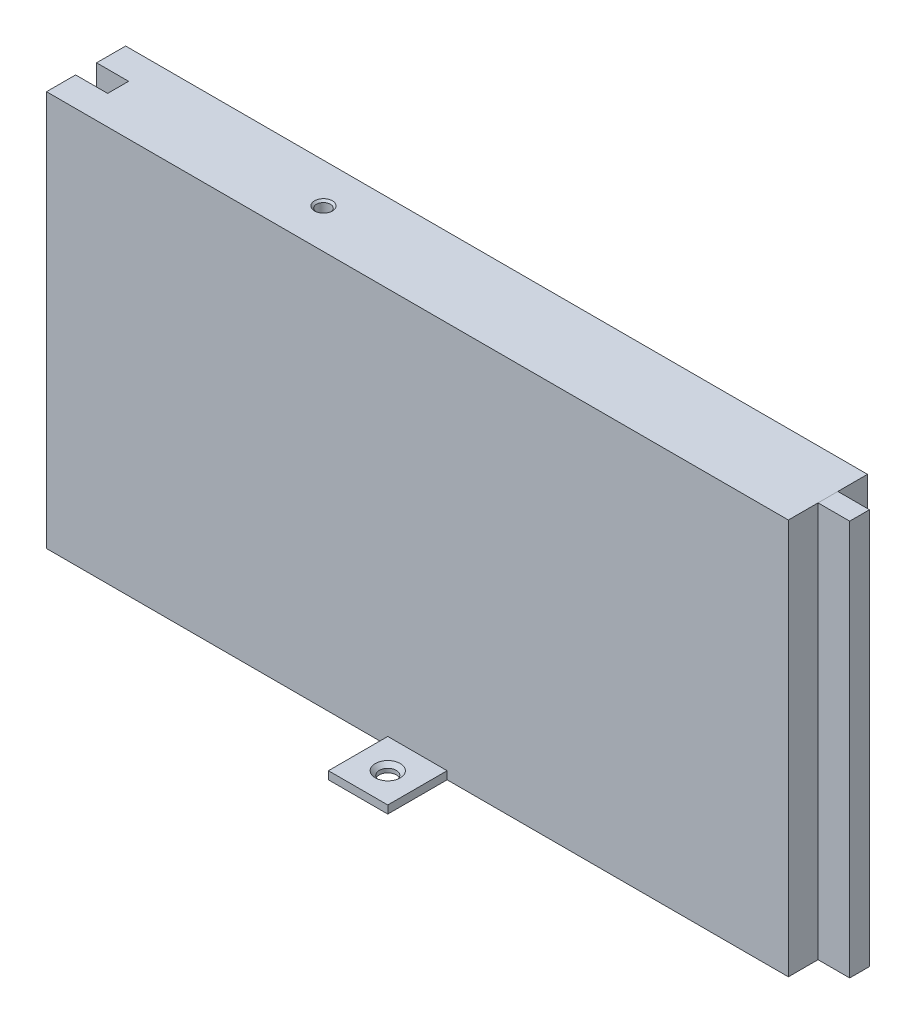
ISO-10303-21;
HEADER;
FILE_DESCRIPTION(('STEP AP214'),'2;1');
FILE_NAME('part.step','',(''),(''),'','','');
FILE_SCHEMA(('AUTOMOTIVE_DESIGN { 1 0 10303 214 1 1 1 1 }'));
ENDSEC;
DATA;
#1=APPLICATION_CONTEXT('core data for automotive mechanical design processes');
#2=APPLICATION_PROTOCOL_DEFINITION('international standard','automotive_design',2000,#1);
#3=PRODUCT_CONTEXT('',#1,'mechanical');
#4=PRODUCT('Part','Part','',(#3));
#5=PRODUCT_RELATED_PRODUCT_CATEGORY('part','',(#4));
#6=PRODUCT_DEFINITION_FORMATION('','',#4);
#7=PRODUCT_DEFINITION_CONTEXT('part definition',#1,'design');
#8=PRODUCT_DEFINITION('design','',#6,#7);
#9=PRODUCT_DEFINITION_SHAPE('','',#8);
#10=(LENGTH_UNIT() NAMED_UNIT(*) SI_UNIT(.MILLI.,.METRE.));
#11=(NAMED_UNIT(*) PLANE_ANGLE_UNIT() SI_UNIT($,.RADIAN.));
#12=(NAMED_UNIT(*) SI_UNIT($,.STERADIAN.) SOLID_ANGLE_UNIT());
#13=UNCERTAINTY_MEASURE_WITH_UNIT(LENGTH_MEASURE(1.E-05),#10,'distance_accuracy_value','');
#14=(GEOMETRIC_REPRESENTATION_CONTEXT(3) GLOBAL_UNCERTAINTY_ASSIGNED_CONTEXT((#13)) GLOBAL_UNIT_ASSIGNED_CONTEXT((#10,
#11,#12)) REPRESENTATION_CONTEXT('',''));
#15=CARTESIAN_POINT('',(0.,0.,0.));
#16=DIRECTION('',(0.,0.,1.));
#17=DIRECTION('',(1.,0.,0.));
#18=AXIS2_PLACEMENT_3D('',#15,#16,#17);
#19=CARTESIAN_POINT('',(187.5,0.,-7.5));
#20=DIRECTION('',(-1.,0.,0.));
#21=DIRECTION('',(0.,0.,1.));
#22=AXIS2_PLACEMENT_3D('',#19,#20,#21);
#23=PLANE('',#22);
#24=DIRECTION('',(0.,0.,1.));
#25=VECTOR('',#24,1.);
#26=CARTESIAN_POINT('',(187.5,100.,-7.5));
#27=LINE('',#26,#25);
#28=CARTESIAN_POINT('',(187.5,100.,-12.5));
#29=VERTEX_POINT('',#28);
#30=CARTESIAN_POINT('',(187.5,100.,-7.5));
#31=VERTEX_POINT('',#30);
#32=EDGE_CURVE('E120',#29,#31,#27,.T.);
#33=ORIENTED_EDGE('',*,*,#32,.F.);
#34=DIRECTION('',(0.,1.,0.));
#35=VECTOR('',#34,1.);
#36=CARTESIAN_POINT('',(187.5,0.,-12.5));
#37=LINE('',#36,#35);
#38=CARTESIAN_POINT('',(187.5,0.,-12.5));
#39=VERTEX_POINT('',#38);
#40=EDGE_CURVE('E12',#39,#29,#37,.T.);
#41=ORIENTED_EDGE('',*,*,#40,.F.);
#42=DIRECTION('',(0.,0.,1.));
#43=VECTOR('',#42,1.);
#44=CARTESIAN_POINT('',(187.5,0.,-7.5));
#45=LINE('',#44,#43);
#46=CARTESIAN_POINT('',(187.5,0.,-7.5));
#47=VERTEX_POINT('',#46);
#48=EDGE_CURVE('E114',#39,#47,#45,.T.);
#49=ORIENTED_EDGE('',*,*,#48,.T.);
#50=DIRECTION('',(0.,1.,0.));
#51=VECTOR('',#50,1.);
#52=CARTESIAN_POINT('',(187.5,0.,-7.5));
#53=LINE('',#52,#51);
#54=EDGE_CURVE('E59',#47,#31,#53,.T.);
#55=ORIENTED_EDGE('',*,*,#54,.T.);
#56=EDGE_LOOP('',(#33,#41,#49,#55));
#57=FACE_BOUND('',#56,.T.);
#58=ADVANCED_FACE('F56',(#57),#23,.T.);
#59=CARTESIAN_POINT('',(187.5,0.,-12.5));
#60=DIRECTION('',(0.,0.,-1.));
#61=DIRECTION('',(-1.,0.,0.));
#62=AXIS2_PLACEMENT_3D('',#59,#60,#61);
#63=PLANE('',#62);
#64=DIRECTION('',(-1.,0.,0.));
#65=VECTOR('',#64,1.);
#66=CARTESIAN_POINT('',(187.5,100.,-12.5));
#67=LINE('',#66,#65);
#68=CARTESIAN_POINT('',(195.5,100.,-12.5));
#69=VERTEX_POINT('',#68);
#70=EDGE_CURVE('E116',#69,#29,#67,.T.);
#71=ORIENTED_EDGE('',*,*,#70,.F.);
#72=DIRECTION('',(0.,1.,0.));
#73=VECTOR('',#72,1.);
#74=CARTESIAN_POINT('',(195.5,0.,-12.5));
#75=LINE('',#74,#73);
#76=CARTESIAN_POINT('',(195.5,0.,-12.5));
#77=VERTEX_POINT('',#76);
#78=EDGE_CURVE('E65',#77,#69,#75,.T.);
#79=ORIENTED_EDGE('',*,*,#78,.F.);
#80=DIRECTION('',(-1.,0.,0.));
#81=VECTOR('',#80,1.);
#82=CARTESIAN_POINT('',(187.5,0.,-12.5));
#83=LINE('',#82,#81);
#84=EDGE_CURVE('E111',#77,#39,#83,.T.);
#85=ORIENTED_EDGE('',*,*,#84,.T.);
#86=ORIENTED_EDGE('',*,*,#40,.T.);
#87=EDGE_LOOP('',(#71,#79,#85,#86));
#88=FACE_BOUND('',#87,.T.);
#89=ADVANCED_FACE('F130',(#88),#63,.T.);
#90=CARTESIAN_POINT('',(195.5,0.,-12.5));
#91=DIRECTION('',(1.,0.,0.));
#92=DIRECTION('',(0.,0.,-1.));
#93=AXIS2_PLACEMENT_3D('',#90,#91,#92);
#94=PLANE('',#93);
#95=DIRECTION('',(0.,0.,-1.));
#96=VECTOR('',#95,1.);
#97=CARTESIAN_POINT('',(195.5,100.,-12.5));
#98=LINE('',#97,#96);
#99=CARTESIAN_POINT('',(195.5,100.,-7.5));
#100=VERTEX_POINT('',#99);
#101=EDGE_CURVE('E106',#100,#69,#98,.T.);
#102=ORIENTED_EDGE('',*,*,#101,.F.);
#103=DIRECTION('',(0.,1.,0.));
#104=VECTOR('',#103,1.);
#105=CARTESIAN_POINT('',(195.5,0.,-7.5));
#106=LINE('',#105,#104);
#107=CARTESIAN_POINT('',(195.5,0.,-7.5));
#108=VERTEX_POINT('',#107);
#109=EDGE_CURVE('E101',#108,#100,#106,.T.);
#110=ORIENTED_EDGE('',*,*,#109,.F.);
#111=DIRECTION('',(0.,0.,-1.));
#112=VECTOR('',#111,1.);
#113=CARTESIAN_POINT('',(195.5,0.,-12.5));
#114=LINE('',#113,#112);
#115=EDGE_CURVE('E104',#108,#77,#114,.T.);
#116=ORIENTED_EDGE('',*,*,#115,.T.);
#117=ORIENTED_EDGE('',*,*,#78,.T.);
#118=EDGE_LOOP('',(#102,#110,#116,#117));
#119=FACE_BOUND('',#118,.T.);
#120=ADVANCED_FACE('F103',(#119),#94,.T.);
#121=CARTESIAN_POINT('',(195.5,0.,-7.5));
#122=DIRECTION('',(0.,0.,1.));
#123=DIRECTION('',(1.,0.,0.));
#124=AXIS2_PLACEMENT_3D('',#121,#122,#123);
#125=PLANE('',#124);
#126=DIRECTION('',(1.,0.,0.));
#127=VECTOR('',#126,1.);
#128=CARTESIAN_POINT('',(195.5,100.,-7.5));
#129=LINE('',#128,#127);
#130=EDGE_CURVE('E123',#31,#100,#129,.T.);
#131=ORIENTED_EDGE('',*,*,#130,.F.);
#132=ORIENTED_EDGE('',*,*,#54,.F.);
#133=DIRECTION('',(1.,0.,0.));
#134=VECTOR('',#133,1.);
#135=CARTESIAN_POINT('',(195.5,0.,-7.5));
#136=LINE('',#135,#134);
#137=EDGE_CURVE('E110',#47,#108,#136,.T.);
#138=ORIENTED_EDGE('',*,*,#137,.T.);
#139=ORIENTED_EDGE('',*,*,#109,.T.);
#140=EDGE_LOOP('',(#131,#132,#138,#139));
#141=FACE_BOUND('',#140,.T.);
#142=ADVANCED_FACE('F113',(#141),#125,.T.);
#143=CARTESIAN_POINT('',(0.,0.,0.));
#144=DIRECTION('',(0.,-1.,0.));
#145=DIRECTION('',(0.,0.,-1.));
#146=AXIS2_PLACEMENT_3D('',#143,#144,#145);
#147=PLANE('',#146);
#148=ORIENTED_EDGE('',*,*,#48,.F.);
#149=ORIENTED_EDGE('',*,*,#84,.F.);
#150=ORIENTED_EDGE('',*,*,#115,.F.);
#151=ORIENTED_EDGE('',*,*,#137,.F.);
#152=EDGE_LOOP('',(#148,#149,#150,#151));
#153=FACE_BOUND('',#152,.T.);
#154=ADVANCED_FACE('F109',(#153),#147,.T.);
#155=CARTESIAN_POINT('',(0.,100.,0.));
#156=DIRECTION('',(0.,-1.,0.));
#157=DIRECTION('',(0.,0.,-1.));
#158=AXIS2_PLACEMENT_3D('',#155,#156,#157);
#159=PLANE('',#158);
#160=ORIENTED_EDGE('',*,*,#32,.T.);
#161=ORIENTED_EDGE('',*,*,#130,.T.);
#162=ORIENTED_EDGE('',*,*,#101,.T.);
#163=ORIENTED_EDGE('',*,*,#70,.T.);
#164=EDGE_LOOP('',(#160,#161,#162,#163));
#165=FACE_BOUND('',#164,.T.);
#166=ADVANCED_FACE('F129',(#165),#159,.F.);
#167=CLOSED_SHELL('',(#58,#89,#120,#142,#154,#166));
#168=MANIFOLD_SOLID_BREP('B2',#167);
#169=CARTESIAN_POINT('',(187.5,100.,0.));
#170=DIRECTION('',(0.,0.,-1.));
#171=DIRECTION('',(-1.,0.,0.));
#172=AXIS2_PLACEMENT_3D('',#169,#170,#171);
#173=PLANE('',#172);
#174=DIRECTION('',(0.,-1.,0.));
#175=VECTOR('',#174,1.);
#176=CARTESIAN_POINT('',(86.25,2.,0.));
#177=LINE('',#176,#175);
#178=CARTESIAN_POINT('',(86.25,2.,0.));
#179=VERTEX_POINT('',#178);
#180=CARTESIAN_POINT('',(86.25,0.,0.));
#181=VERTEX_POINT('',#180);
#182=EDGE_CURVE('E196',#179,#181,#177,.T.);
#183=ORIENTED_EDGE('',*,*,#182,.F.);
#184=DIRECTION('',(-1.,0.,0.));
#185=VECTOR('',#184,1.);
#186=CARTESIAN_POINT('',(86.25,2.,0.));
#187=LINE('',#186,#185);
#188=CARTESIAN_POINT('',(101.25,2.,0.));
#189=VERTEX_POINT('',#188);
#190=EDGE_CURVE('E316',#189,#179,#187,.T.);
#191=ORIENTED_EDGE('',*,*,#190,.F.);
#192=DIRECTION('',(0.,1.,0.));
#193=VECTOR('',#192,1.);
#194=CARTESIAN_POINT('',(101.25,2.,0.));
#195=LINE('',#194,#193);
#196=CARTESIAN_POINT('',(101.25,0.,0.));
#197=VERTEX_POINT('',#196);
#198=EDGE_CURVE('E202',#197,#189,#195,.T.);
#199=ORIENTED_EDGE('',*,*,#198,.F.);
#200=DIRECTION('',(1.,0.,0.));
#201=VECTOR('',#200,1.);
#202=CARTESIAN_POINT('',(187.5,0.,0.));
#203=LINE('',#202,#201);
#204=CARTESIAN_POINT('',(187.5,0.,0.));
#205=VERTEX_POINT('',#204);
#206=EDGE_CURVE('E398',#197,#205,#203,.T.);
#207=ORIENTED_EDGE('',*,*,#206,.T.);
#208=DIRECTION('',(0.,-1.,0.));
#209=VECTOR('',#208,1.);
#210=CARTESIAN_POINT('',(187.5,100.,0.));
#211=LINE('',#210,#209);
#212=CARTESIAN_POINT('',(187.5,100.,0.));
#213=VERTEX_POINT('',#212);
#214=EDGE_CURVE('E449',#213,#205,#211,.T.);
#215=ORIENTED_EDGE('',*,*,#214,.F.);
#216=DIRECTION('',(1.,0.,0.));
#217=VECTOR('',#216,1.);
#218=CARTESIAN_POINT('',(187.5,100.,0.));
#219=LINE('',#218,#217);
#220=CARTESIAN_POINT('',(0.,100.,0.));
#221=VERTEX_POINT('',#220);
#222=EDGE_CURVE('E407',#221,#213,#219,.T.);
#223=ORIENTED_EDGE('',*,*,#222,.F.);
#224=DIRECTION('',(0.,-1.,0.));
#225=VECTOR('',#224,1.);
#226=CARTESIAN_POINT('',(0.,100.,0.));
#227=LINE('',#226,#225);
#228=CARTESIAN_POINT('',(0.,0.,0.));
#229=VERTEX_POINT('',#228);
#230=EDGE_CURVE('E423',#221,#229,#227,.T.);
#231=ORIENTED_EDGE('',*,*,#230,.T.);
#232=EDGE_CURVE('E424',#229,#181,#203,.T.);
#233=ORIENTED_EDGE('',*,*,#232,.T.);
#234=EDGE_LOOP('',(#183,#191,#199,#207,#215,#223,#231,#233));
#235=FACE_BOUND('',#234,.T.);
#236=ADVANCED_FACE('F179',(#235),#173,.F.);
#237=CARTESIAN_POINT('',(0.,100.,-20.));
#238=DIRECTION('',(0.,0.,1.));
#239=DIRECTION('',(1.,0.,0.));
#240=AXIS2_PLACEMENT_3D('',#237,#238,#239);
#241=PLANE('',#240);
#242=DIRECTION('',(0.,-1.,0.));
#243=VECTOR('',#242,1.);
#244=CARTESIAN_POINT('',(101.25,1.99999999999998,-20.));
#245=LINE('',#244,#243);
#246=CARTESIAN_POINT('',(101.25,1.99999999999998,-20.));
#247=VERTEX_POINT('',#246);
#248=CARTESIAN_POINT('',(101.25,0.,-20.));
#249=VERTEX_POINT('',#248);
#250=EDGE_CURVE('E320',#247,#249,#245,.T.);
#251=ORIENTED_EDGE('',*,*,#250,.F.);
#252=DIRECTION('',(1.,0.,0.));
#253=VECTOR('',#252,1.);
#254=CARTESIAN_POINT('',(101.25,1.99999999999998,-20.));
#255=LINE('',#254,#253);
#256=CARTESIAN_POINT('',(86.25,1.99999999999998,-20.));
#257=VERTEX_POINT('',#256);
#258=EDGE_CURVE('E336',#257,#247,#255,.T.);
#259=ORIENTED_EDGE('',*,*,#258,.F.);
#260=DIRECTION('',(0.,1.,0.));
#261=VECTOR('',#260,1.);
#262=CARTESIAN_POINT('',(86.25,1.99999999999998,-20.));
#263=LINE('',#262,#261);
#264=CARTESIAN_POINT('',(86.25,0.,-20.));
#265=VERTEX_POINT('',#264);
#266=EDGE_CURVE('E325',#265,#257,#263,.T.);
#267=ORIENTED_EDGE('',*,*,#266,.F.);
#268=DIRECTION('',(-1.,0.,0.));
#269=VECTOR('',#268,1.);
#270=CARTESIAN_POINT('',(0.,0.,-20.));
#271=LINE('',#270,#269);
#272=CARTESIAN_POINT('',(0.,0.,-20.));
#273=VERTEX_POINT('',#272);
#274=EDGE_CURVE('E430',#265,#273,#271,.T.);
#275=ORIENTED_EDGE('',*,*,#274,.T.);
#276=DIRECTION('',(0.,-1.,0.));
#277=VECTOR('',#276,1.);
#278=CARTESIAN_POINT('',(0.,100.,-20.));
#279=LINE('',#278,#277);
#280=CARTESIAN_POINT('',(0.,100.,-20.));
#281=VERTEX_POINT('',#280);
#282=EDGE_CURVE('E441',#281,#273,#279,.T.);
#283=ORIENTED_EDGE('',*,*,#282,.F.);
#284=DIRECTION('',(-1.,0.,0.));
#285=VECTOR('',#284,1.);
#286=CARTESIAN_POINT('',(0.,100.,-20.));
#287=LINE('',#286,#285);
#288=CARTESIAN_POINT('',(187.5,100.,-20.));
#289=VERTEX_POINT('',#288);
#290=EDGE_CURVE('E415',#289,#281,#287,.T.);
#291=ORIENTED_EDGE('',*,*,#290,.F.);
#292=DIRECTION('',(0.,-1.,0.));
#293=VECTOR('',#292,1.);
#294=CARTESIAN_POINT('',(187.5,100.,-20.));
#295=LINE('',#294,#293);
#296=CARTESIAN_POINT('',(187.5,0.,-20.));
#297=VERTEX_POINT('',#296);
#298=EDGE_CURVE('E445',#289,#297,#295,.T.);
#299=ORIENTED_EDGE('',*,*,#298,.T.);
#300=EDGE_CURVE('E431',#297,#249,#271,.T.);
#301=ORIENTED_EDGE('',*,*,#300,.T.);
#302=EDGE_LOOP('',(#251,#259,#267,#275,#283,#291,#299,#301));
#303=FACE_BOUND('',#302,.T.);
#304=ADVANCED_FACE('F484',(#303),#241,.F.);
#305=CARTESIAN_POINT('',(0.,100.,0.));
#306=DIRECTION('',(1.,0.,0.));
#307=DIRECTION('',(0.,0.,-1.));
#308=AXIS2_PLACEMENT_3D('',#305,#306,#307);
#309=PLANE('',#308);
#310=DIRECTION('',(0.,0.,1.));
#311=VECTOR('',#310,1.);
#312=CARTESIAN_POINT('',(0.,0.,0.));
#313=LINE('',#312,#311);
#314=CARTESIAN_POINT('',(0.,0.,-12.65));
#315=VERTEX_POINT('',#314);
#316=EDGE_CURVE('E412',#273,#315,#313,.T.);
#317=ORIENTED_EDGE('',*,*,#316,.T.);
#318=DIRECTION('',(0.,1.,0.));
#319=VECTOR('',#318,1.);
#320=CARTESIAN_POINT('',(0.,0.,-12.65));
#321=LINE('',#320,#319);
#322=CARTESIAN_POINT('',(0.,100.,-12.65));
#323=VERTEX_POINT('',#322);
#324=EDGE_CURVE('E394',#315,#323,#321,.T.);
#325=ORIENTED_EDGE('',*,*,#324,.T.);
#326=DIRECTION('',(0.,0.,1.));
#327=VECTOR('',#326,1.);
#328=CARTESIAN_POINT('',(0.,100.,0.));
#329=LINE('',#328,#327);
#330=EDGE_CURVE('E419',#281,#323,#329,.T.);
#331=ORIENTED_EDGE('',*,*,#330,.F.);
#332=ORIENTED_EDGE('',*,*,#282,.T.);
#333=EDGE_LOOP('',(#317,#325,#331,#332));
#334=FACE_BOUND('',#333,.T.);
#335=ADVANCED_FACE('F491',(#334),#309,.F.);
#336=CARTESIAN_POINT('',(187.5,100.,-20.));
#337=DIRECTION('',(-1.,0.,0.));
#338=DIRECTION('',(0.,0.,1.));
#339=AXIS2_PLACEMENT_3D('',#336,#337,#338);
#340=PLANE('',#339);
#341=DIRECTION('',(0.,0.,-1.));
#342=VECTOR('',#341,1.);
#343=CARTESIAN_POINT('',(187.5,0.,-20.));
#344=LINE('',#343,#342);
#345=EDGE_CURVE('E427',#205,#297,#344,.T.);
#346=ORIENTED_EDGE('',*,*,#345,.T.);
#347=ORIENTED_EDGE('',*,*,#298,.F.);
#348=DIRECTION('',(0.,0.,-1.));
#349=VECTOR('',#348,1.);
#350=CARTESIAN_POINT('',(187.5,100.,-20.));
#351=LINE('',#350,#349);
#352=EDGE_CURVE('E411',#213,#289,#351,.T.);
#353=ORIENTED_EDGE('',*,*,#352,.F.);
#354=ORIENTED_EDGE('',*,*,#214,.T.);
#355=EDGE_LOOP('',(#346,#347,#353,#354));
#356=FACE_BOUND('',#355,.T.);
#357=ADVANCED_FACE('F496',(#356),#340,.F.);
#358=CARTESIAN_POINT('',(0.,100.,-7.35));
#359=VERTEX_POINT('',#358);
#360=EDGE_CURVE('E418',#359,#221,#329,.T.);
#361=ORIENTED_EDGE('',*,*,#360,.F.);
#362=DIRECTION('',(0.,1.,0.));
#363=VECTOR('',#362,1.);
#364=CARTESIAN_POINT('',(0.,0.,-7.35));
#365=LINE('',#364,#363);
#366=CARTESIAN_POINT('',(0.,0.,-7.35));
#367=VERTEX_POINT('',#366);
#368=EDGE_CURVE('E384',#367,#359,#365,.T.);
#369=ORIENTED_EDGE('',*,*,#368,.F.);
#370=EDGE_CURVE('E434',#367,#229,#313,.T.);
#371=ORIENTED_EDGE('',*,*,#370,.T.);
#372=ORIENTED_EDGE('',*,*,#230,.F.);
#373=EDGE_LOOP('',(#361,#369,#371,#372));
#374=FACE_BOUND('',#373,.T.);
#375=ADVANCED_FACE('F546',(#374),#309,.F.);
#376=CARTESIAN_POINT('',(0.,100.,0.));
#377=DIRECTION('',(0.,-1.,0.));
#378=DIRECTION('',(0.,0.,-1.));
#379=AXIS2_PLACEMENT_3D('',#376,#377,#378);
#380=PLANE('',#379);
#381=CARTESIAN_POINT('',(60.,100.,-10.));
#382=DIRECTION('',(0.,-1.,0.));
#383=DIRECTION('',(0.,0.,-1.));
#384=AXIS2_PLACEMENT_3D('',#381,#382,#383);
#385=CIRCLE('',#384,2.25);
#386=CARTESIAN_POINT('',(60.,100.,-12.25));
#387=VERTEX_POINT('',#386);
#388=EDGE_CURVE('E457',#387,#387,#385,.T.);
#389=ORIENTED_EDGE('',*,*,#388,.T.);
#390=EDGE_LOOP('',(#389));
#391=FACE_BOUND('',#390,.T.);
#392=ORIENTED_EDGE('',*,*,#330,.T.);
#393=DIRECTION('',(-1.,0.,0.));
#394=VECTOR('',#393,1.);
#395=CARTESIAN_POINT('',(0.,100.,-12.65));
#396=LINE('',#395,#394);
#397=CARTESIAN_POINT('',(8.1,100.,-12.65));
#398=VERTEX_POINT('',#397);
#399=EDGE_CURVE('E377',#398,#323,#396,.T.);
#400=ORIENTED_EDGE('',*,*,#399,.F.);
#401=DIRECTION('',(0.,0.,-1.));
#402=VECTOR('',#401,1.);
#403=CARTESIAN_POINT('',(8.1,100.,-12.65));
#404=LINE('',#403,#402);
#405=CARTESIAN_POINT('',(8.1,100.,-7.35));
#406=VERTEX_POINT('',#405);
#407=EDGE_CURVE('E388',#406,#398,#404,.T.);
#408=ORIENTED_EDGE('',*,*,#407,.F.);
#409=DIRECTION('',(1.,0.,0.));
#410=VECTOR('',#409,1.);
#411=CARTESIAN_POINT('',(8.1,100.,-7.35));
#412=LINE('',#411,#410);
#413=EDGE_CURVE('E371',#359,#406,#412,.T.);
#414=ORIENTED_EDGE('',*,*,#413,.F.);
#415=ORIENTED_EDGE('',*,*,#360,.T.);
#416=ORIENTED_EDGE('',*,*,#222,.T.);
#417=ORIENTED_EDGE('',*,*,#352,.T.);
#418=ORIENTED_EDGE('',*,*,#290,.T.);
#419=EDGE_LOOP('',(#392,#400,#408,#414,#415,#416,#417,#418));
#420=FACE_BOUND('',#419,.T.);
#421=ADVANCED_FACE('F544',(#391,#420),#380,.F.);
#422=CARTESIAN_POINT('',(0.,0.,0.));
#423=DIRECTION('',(0.,-1.,0.));
#424=DIRECTION('',(0.,0.,-1.));
#425=AXIS2_PLACEMENT_3D('',#422,#423,#424);
#426=PLANE('',#425);
#427=CARTESIAN_POINT('',(93.75,0.,-27.5));
#428=DIRECTION('',(0.,-1.,0.));
#429=DIRECTION('',(0.,0.,-1.));
#430=AXIS2_PLACEMENT_3D('',#427,#428,#429);
#431=CIRCLE('',#430,2.15);
#432=CARTESIAN_POINT('',(93.75,0.,-29.65));
#433=VERTEX_POINT('',#432);
#434=EDGE_CURVE('E771',#433,#433,#431,.T.);
#435=ORIENTED_EDGE('',*,*,#434,.F.);
#436=EDGE_LOOP('',(#435));
#437=FACE_BOUND('',#436,.T.);
#438=CARTESIAN_POINT('',(93.75,0.,7.5));
#439=DIRECTION('',(0.,-1.,0.));
#440=DIRECTION('',(0.,0.,-1.));
#441=AXIS2_PLACEMENT_3D('',#438,#439,#440);
#442=CIRCLE('',#441,2.15);
#443=CARTESIAN_POINT('',(93.75,0.,5.35));
#444=VERTEX_POINT('',#443);
#445=EDGE_CURVE('E768',#444,#444,#442,.T.);
#446=ORIENTED_EDGE('',*,*,#445,.F.);
#447=EDGE_LOOP('',(#446));
#448=FACE_BOUND('',#447,.T.);
#449=DIRECTION('',(-1.,0.,0.));
#450=VECTOR('',#449,1.);
#451=CARTESIAN_POINT('',(0.,0.,-12.65));
#452=LINE('',#451,#450);
#453=CARTESIAN_POINT('',(8.1,0.,-12.65));
#454=VERTEX_POINT('',#453);
#455=EDGE_CURVE('E381',#454,#315,#452,.T.);
#456=ORIENTED_EDGE('',*,*,#455,.T.);
#457=ORIENTED_EDGE('',*,*,#316,.F.);
#458=ORIENTED_EDGE('',*,*,#274,.F.);
#459=DIRECTION('',(0.,0.,1.));
#460=VECTOR('',#459,1.);
#461=CARTESIAN_POINT('',(86.25,0.,-35.));
#462=LINE('',#461,#460);
#463=CARTESIAN_POINT('',(86.25,0.,-35.));
#464=VERTEX_POINT('',#463);
#465=EDGE_CURVE('E359',#464,#265,#462,.T.);
#466=ORIENTED_EDGE('',*,*,#465,.F.);
#467=DIRECTION('',(-1.,0.,0.));
#468=VECTOR('',#467,1.);
#469=CARTESIAN_POINT('',(101.25,0.,-35.));
#470=LINE('',#469,#468);
#471=CARTESIAN_POINT('',(101.25,0.,-35.));
#472=VERTEX_POINT('',#471);
#473=EDGE_CURVE('E335',#472,#464,#470,.T.);
#474=ORIENTED_EDGE('',*,*,#473,.F.);
#475=DIRECTION('',(0.,0.,1.));
#476=VECTOR('',#475,1.);
#477=CARTESIAN_POINT('',(101.25,0.,-35.));
#478=LINE('',#477,#476);
#479=EDGE_CURVE('E363',#472,#249,#478,.T.);
#480=ORIENTED_EDGE('',*,*,#479,.T.);
#481=ORIENTED_EDGE('',*,*,#300,.F.);
#482=ORIENTED_EDGE('',*,*,#345,.F.);
#483=ORIENTED_EDGE('',*,*,#206,.F.);
#484=DIRECTION('',(0.,0.,-1.));
#485=VECTOR('',#484,1.);
#486=CARTESIAN_POINT('',(101.25,0.,15.));
#487=LINE('',#486,#485);
#488=CARTESIAN_POINT('',(101.25,0.,15.));
#489=VERTEX_POINT('',#488);
#490=EDGE_CURVE('E301',#489,#197,#487,.T.);
#491=ORIENTED_EDGE('',*,*,#490,.F.);
#492=DIRECTION('',(1.,0.,0.));
#493=VECTOR('',#492,1.);
#494=CARTESIAN_POINT('',(86.25,0.,15.));
#495=LINE('',#494,#493);
#496=CARTESIAN_POINT('',(86.25,0.,15.));
#497=VERTEX_POINT('',#496);
#498=EDGE_CURVE('E293',#497,#489,#495,.T.);
#499=ORIENTED_EDGE('',*,*,#498,.F.);
#500=DIRECTION('',(0.,0.,-1.));
#501=VECTOR('',#500,1.);
#502=CARTESIAN_POINT('',(86.25,0.,15.));
#503=LINE('',#502,#501);
#504=EDGE_CURVE('E299',#497,#181,#503,.T.);
#505=ORIENTED_EDGE('',*,*,#504,.T.);
#506=ORIENTED_EDGE('',*,*,#232,.F.);
#507=ORIENTED_EDGE('',*,*,#370,.F.);
#508=DIRECTION('',(1.,0.,0.));
#509=VECTOR('',#508,1.);
#510=CARTESIAN_POINT('',(8.1,0.,-7.35));
#511=LINE('',#510,#509);
#512=CARTESIAN_POINT('',(8.1,0.,-7.35));
#513=VERTEX_POINT('',#512);
#514=EDGE_CURVE('E372',#367,#513,#511,.T.);
#515=ORIENTED_EDGE('',*,*,#514,.T.);
#516=DIRECTION('',(0.,0.,-1.));
#517=VECTOR('',#516,1.);
#518=CARTESIAN_POINT('',(8.1,0.,-12.65));
#519=LINE('',#518,#517);
#520=EDGE_CURVE('E376',#513,#454,#519,.T.);
#521=ORIENTED_EDGE('',*,*,#520,.T.);
#522=EDGE_LOOP('',(#456,#457,#458,#466,#474,#480,#481,#482,#483,#491,#499,#505,#506,#507,#515,#521));
#523=FACE_BOUND('',#522,.T.);
#524=ADVANCED_FACE('F296',(#437,#448,#523),#426,.T.);
#525=CARTESIAN_POINT('',(0.,0.,-12.65));
#526=DIRECTION('',(0.,0.,-1.));
#527=DIRECTION('',(-1.,0.,0.));
#528=AXIS2_PLACEMENT_3D('',#525,#526,#527);
#529=PLANE('',#528);
#530=ORIENTED_EDGE('',*,*,#399,.T.);
#531=ORIENTED_EDGE('',*,*,#324,.F.);
#532=ORIENTED_EDGE('',*,*,#455,.F.);
#533=DIRECTION('',(0.,1.,0.));
#534=VECTOR('',#533,1.);
#535=CARTESIAN_POINT('',(8.1,0.,-12.65));
#536=LINE('',#535,#534);
#537=EDGE_CURVE('E399',#454,#398,#536,.T.);
#538=ORIENTED_EDGE('',*,*,#537,.T.);
#539=EDGE_LOOP('',(#530,#531,#532,#538));
#540=FACE_BOUND('',#539,.T.);
#541=ADVANCED_FACE('F537',(#540),#529,.F.);
#542=CARTESIAN_POINT('',(8.1,0.,-12.65));
#543=DIRECTION('',(1.,0.,0.));
#544=DIRECTION('',(0.,0.,-1.));
#545=AXIS2_PLACEMENT_3D('',#542,#543,#544);
#546=PLANE('',#545);
#547=ORIENTED_EDGE('',*,*,#407,.T.);
#548=ORIENTED_EDGE('',*,*,#537,.F.);
#549=ORIENTED_EDGE('',*,*,#520,.F.);
#550=DIRECTION('',(0.,1.,0.));
#551=VECTOR('',#550,1.);
#552=CARTESIAN_POINT('',(8.1,0.,-7.35));
#553=LINE('',#552,#551);
#554=EDGE_CURVE('E402',#513,#406,#553,.T.);
#555=ORIENTED_EDGE('',*,*,#554,.T.);
#556=EDGE_LOOP('',(#547,#548,#549,#555));
#557=FACE_BOUND('',#556,.T.);
#558=ADVANCED_FACE('F533',(#557),#546,.F.);
#559=CARTESIAN_POINT('',(8.1,0.,-7.35));
#560=DIRECTION('',(0.,0.,1.));
#561=DIRECTION('',(1.,0.,0.));
#562=AXIS2_PLACEMENT_3D('',#559,#560,#561);
#563=PLANE('',#562);
#564=ORIENTED_EDGE('',*,*,#413,.T.);
#565=ORIENTED_EDGE('',*,*,#554,.F.);
#566=ORIENTED_EDGE('',*,*,#514,.F.);
#567=ORIENTED_EDGE('',*,*,#368,.T.);
#568=EDGE_LOOP('',(#564,#565,#566,#567));
#569=FACE_BOUND('',#568,.T.);
#570=ADVANCED_FACE('F526',(#569),#563,.F.);
#571=CARTESIAN_POINT('',(60.,92.,-10.));
#572=DIRECTION('',(0.,1.,0.));
#573=DIRECTION('',(0.,0.,1.));
#574=AXIS2_PLACEMENT_3D('',#571,#572,#573);
#575=CYLINDRICAL_SURFACE('',#574,1.75);
#576=CARTESIAN_POINT('',(60.,99.5,-10.));
#577=DIRECTION('',(0.,-1.,0.));
#578=DIRECTION('',(0.,0.,-1.));
#579=AXIS2_PLACEMENT_3D('',#576,#577,#578);
#580=CIRCLE('',#579,1.75);
#581=CARTESIAN_POINT('',(60.,99.5,-11.75));
#582=VERTEX_POINT('',#581);
#583=EDGE_CURVE('E453',#582,#582,#580,.F.);
#584=ORIENTED_EDGE('',*,*,#583,.T.);
#585=EDGE_LOOP('',(#584));
#586=FACE_BOUND('',#585,.T.);
#587=CARTESIAN_POINT('',(60.,92.,-10.));
#588=DIRECTION('',(0.,1.,0.));
#589=DIRECTION('',(0.,0.,1.));
#590=AXIS2_PLACEMENT_3D('',#587,#588,#589);
#591=CIRCLE('',#590,1.75);
#592=CARTESIAN_POINT('',(60.,92.,-8.25));
#593=VERTEX_POINT('',#592);
#594=EDGE_CURVE('E367',#593,#593,#591,.T.);
#595=ORIENTED_EDGE('',*,*,#594,.F.);
#596=EDGE_LOOP('',(#595));
#597=FACE_BOUND('',#596,.T.);
#598=ADVANCED_FACE('F518',(#586,#597),#575,.F.);
#599=CARTESIAN_POINT('',(60.,92.,-10.));
#600=DIRECTION('',(0.,1.,0.));
#601=DIRECTION('',(0.,0.,1.));
#602=AXIS2_PLACEMENT_3D('',#599,#600,#601);
#603=PLANE('',#602);
#604=ORIENTED_EDGE('',*,*,#594,.T.);
#605=EDGE_LOOP('',(#604));
#606=FACE_BOUND('',#605,.T.);
#607=ADVANCED_FACE('F504',(#606),#603,.T.);
#608=CARTESIAN_POINT('',(60.,99.5,-10.));
#609=DIRECTION('',(0.,1.,0.));
#610=DIRECTION('',(0.,0.,1.));
#611=AXIS2_PLACEMENT_3D('',#608,#609,#610);
#612=CONICAL_SURFACE('',#611,1.75,0.78539816339746);
#613=ORIENTED_EDGE('',*,*,#388,.F.);
#614=EDGE_LOOP('',(#613));
#615=FACE_BOUND('',#614,.T.);
#616=ORIENTED_EDGE('',*,*,#583,.F.);
#617=EDGE_LOOP('',(#616));
#618=FACE_BOUND('',#617,.T.);
#619=ADVANCED_FACE('F498',(#615,#618),#612,.F.);
#620=CARTESIAN_POINT('',(101.25,1.99999999999998,-35.));
#621=DIRECTION('',(-1.,0.,0.));
#622=DIRECTION('',(0.,0.,1.));
#623=AXIS2_PLACEMENT_3D('',#620,#621,#622);
#624=PLANE('',#623);
#625=ORIENTED_EDGE('',*,*,#250,.T.);
#626=ORIENTED_EDGE('',*,*,#479,.F.);
#627=DIRECTION('',(0.,-1.,0.));
#628=VECTOR('',#627,1.);
#629=CARTESIAN_POINT('',(101.25,1.99999999999998,-35.));
#630=LINE('',#629,#628);
#631=CARTESIAN_POINT('',(101.25,1.99999999999998,-35.));
#632=VERTEX_POINT('',#631);
#633=EDGE_CURVE('E331',#632,#472,#630,.T.);
#634=ORIENTED_EDGE('',*,*,#633,.F.);
#635=DIRECTION('',(0.,0.,1.));
#636=VECTOR('',#635,1.);
#637=CARTESIAN_POINT('',(101.25,1.99999999999998,-35.));
#638=LINE('',#637,#636);
#639=EDGE_CURVE('E344',#632,#247,#638,.T.);
#640=ORIENTED_EDGE('',*,*,#639,.T.);
#641=EDGE_LOOP('',(#625,#626,#634,#640));
#642=FACE_BOUND('',#641,.T.);
#643=ADVANCED_FACE('F503',(#642),#624,.F.);
#644=CARTESIAN_POINT('',(86.25,1.99999999999998,-35.));
#645=DIRECTION('',(1.,0.,0.));
#646=DIRECTION('',(0.,0.,-1.));
#647=AXIS2_PLACEMENT_3D('',#644,#645,#646);
#648=PLANE('',#647);
#649=ORIENTED_EDGE('',*,*,#266,.T.);
#650=DIRECTION('',(0.,0.,1.));
#651=VECTOR('',#650,1.);
#652=CARTESIAN_POINT('',(86.25,1.99999999999998,-35.));
#653=LINE('',#652,#651);
#654=CARTESIAN_POINT('',(86.25,1.99999999999998,-35.));
#655=VERTEX_POINT('',#654);
#656=EDGE_CURVE('E355',#655,#257,#653,.T.);
#657=ORIENTED_EDGE('',*,*,#656,.F.);
#658=DIRECTION('',(0.,1.,0.));
#659=VECTOR('',#658,1.);
#660=CARTESIAN_POINT('',(86.25,1.99999999999998,-35.));
#661=LINE('',#660,#659);
#662=EDGE_CURVE('E339',#464,#655,#661,.T.);
#663=ORIENTED_EDGE('',*,*,#662,.F.);
#664=ORIENTED_EDGE('',*,*,#465,.T.);
#665=EDGE_LOOP('',(#649,#657,#663,#664));
#666=FACE_BOUND('',#665,.T.);
#667=ADVANCED_FACE('F514',(#666),#648,.F.);
#668=CARTESIAN_POINT('',(101.25,1.99999999999998,-35.));
#669=DIRECTION('',(0.,-1.,0.));
#670=DIRECTION('',(1.,0.,0.));
#671=AXIS2_PLACEMENT_3D('',#668,#669,#670);
#672=PLANE('',#671);
#673=CARTESIAN_POINT('',(93.75,1.99999999999998,-27.5));
#674=DIRECTION('',(0.,-1.,0.));
#675=DIRECTION('',(1.,0.,0.));
#676=AXIS2_PLACEMENT_3D('',#673,#674,#675);
#677=CIRCLE('',#676,3.14999999999999);
#678=CARTESIAN_POINT('',(96.9,1.99999999999998,-27.5));
#679=VERTEX_POINT('',#678);
#680=EDGE_CURVE('E54',#679,#679,#677,.T.);
#681=ORIENTED_EDGE('',*,*,#680,.T.);
#682=EDGE_LOOP('',(#681));
#683=FACE_BOUND('',#682,.T.);
#684=ORIENTED_EDGE('',*,*,#258,.T.);
#685=ORIENTED_EDGE('',*,*,#639,.F.);
#686=DIRECTION('',(1.,0.,0.));
#687=VECTOR('',#686,1.);
#688=CARTESIAN_POINT('',(101.25,1.99999999999998,-35.));
#689=LINE('',#688,#687);
#690=EDGE_CURVE('E342',#655,#632,#689,.T.);
#691=ORIENTED_EDGE('',*,*,#690,.F.);
#692=ORIENTED_EDGE('',*,*,#656,.T.);
#693=EDGE_LOOP('',(#684,#685,#691,#692));
#694=FACE_BOUND('',#693,.T.);
#695=ADVANCED_FACE('F591',(#683,#694),#672,.F.);
#696=CARTESIAN_POINT('',(0.,0.,-35.));
#697=DIRECTION('',(0.,0.,-1.));
#698=DIRECTION('',(-1.,0.,0.));
#699=AXIS2_PLACEMENT_3D('',#696,#697,#698);
#700=PLANE('',#699);
#701=ORIENTED_EDGE('',*,*,#633,.T.);
#702=ORIENTED_EDGE('',*,*,#473,.T.);
#703=ORIENTED_EDGE('',*,*,#662,.T.);
#704=ORIENTED_EDGE('',*,*,#690,.T.);
#705=EDGE_LOOP('',(#701,#702,#703,#704));
#706=FACE_BOUND('',#705,.T.);
#707=ADVANCED_FACE('F596',(#706),#700,.T.);
#708=CARTESIAN_POINT('',(86.25,2.,15.));
#709=DIRECTION('',(1.,0.,0.));
#710=DIRECTION('',(0.,0.,-1.));
#711=AXIS2_PLACEMENT_3D('',#708,#709,#710);
#712=PLANE('',#711);
#713=ORIENTED_EDGE('',*,*,#182,.T.);
#714=ORIENTED_EDGE('',*,*,#504,.F.);
#715=DIRECTION('',(0.,-1.,0.));
#716=VECTOR('',#715,1.);
#717=CARTESIAN_POINT('',(86.25,2.,15.));
#718=LINE('',#717,#716);
#719=CARTESIAN_POINT('',(86.25,2.,15.));
#720=VERTEX_POINT('',#719);
#721=EDGE_CURVE('E306',#720,#497,#718,.T.);
#722=ORIENTED_EDGE('',*,*,#721,.F.);
#723=DIRECTION('',(0.,0.,-1.));
#724=VECTOR('',#723,1.);
#725=CARTESIAN_POINT('',(86.25,2.,15.));
#726=LINE('',#725,#724);
#727=EDGE_CURVE('E781',#720,#179,#726,.T.);
#728=ORIENTED_EDGE('',*,*,#727,.T.);
#729=EDGE_LOOP('',(#713,#714,#722,#728));
#730=FACE_BOUND('',#729,.T.);
#731=ADVANCED_FACE('F318',(#730),#712,.F.);
#732=CARTESIAN_POINT('',(101.25,2.,15.));
#733=DIRECTION('',(-1.,0.,0.));
#734=DIRECTION('',(0.,0.,1.));
#735=AXIS2_PLACEMENT_3D('',#732,#733,#734);
#736=PLANE('',#735);
#737=ORIENTED_EDGE('',*,*,#198,.T.);
#738=DIRECTION('',(0.,0.,-1.));
#739=VECTOR('',#738,1.);
#740=CARTESIAN_POINT('',(101.25,2.,15.));
#741=LINE('',#740,#739);
#742=CARTESIAN_POINT('',(101.25,2.,15.));
#743=VERTEX_POINT('',#742);
#744=EDGE_CURVE('E327',#743,#189,#741,.T.);
#745=ORIENTED_EDGE('',*,*,#744,.F.);
#746=DIRECTION('',(0.,1.,0.));
#747=VECTOR('',#746,1.);
#748=CARTESIAN_POINT('',(101.25,2.,15.));
#749=LINE('',#748,#747);
#750=EDGE_CURVE('E305',#489,#743,#749,.T.);
#751=ORIENTED_EDGE('',*,*,#750,.F.);
#752=ORIENTED_EDGE('',*,*,#490,.T.);
#753=EDGE_LOOP('',(#737,#745,#751,#752));
#754=FACE_BOUND('',#753,.T.);
#755=ADVANCED_FACE('F601',(#754),#736,.F.);
#756=CARTESIAN_POINT('',(86.25,2.,15.));
#757=DIRECTION('',(0.,-1.,0.));
#758=DIRECTION('',(1.,0.,0.));
#759=AXIS2_PLACEMENT_3D('',#756,#757,#758);
#760=PLANE('',#759);
#761=CARTESIAN_POINT('',(93.75,2.,7.5));
#762=DIRECTION('',(0.,-1.,0.));
#763=DIRECTION('',(1.,0.,0.));
#764=AXIS2_PLACEMENT_3D('',#761,#762,#763);
#765=CIRCLE('',#764,3.15000000000001);
#766=CARTESIAN_POINT('',(96.9,2.,7.5));
#767=VERTEX_POINT('',#766);
#768=EDGE_CURVE('E465',#767,#767,#765,.T.);
#769=ORIENTED_EDGE('',*,*,#768,.T.);
#770=EDGE_LOOP('',(#769));
#771=FACE_BOUND('',#770,.T.);
#772=ORIENTED_EDGE('',*,*,#190,.T.);
#773=ORIENTED_EDGE('',*,*,#727,.F.);
#774=DIRECTION('',(-1.,0.,0.));
#775=VECTOR('',#774,1.);
#776=CARTESIAN_POINT('',(86.25,2.,15.));
#777=LINE('',#776,#775);
#778=EDGE_CURVE('E311',#743,#720,#777,.T.);
#779=ORIENTED_EDGE('',*,*,#778,.F.);
#780=ORIENTED_EDGE('',*,*,#744,.T.);
#781=EDGE_LOOP('',(#772,#773,#779,#780));
#782=FACE_BOUND('',#781,.T.);
#783=ADVANCED_FACE('F654',(#771,#782),#760,.F.);
#784=CARTESIAN_POINT('',(0.,0.,15.));
#785=DIRECTION('',(0.,0.,1.));
#786=DIRECTION('',(1.,0.,0.));
#787=AXIS2_PLACEMENT_3D('',#784,#785,#786);
#788=PLANE('',#787);
#789=ORIENTED_EDGE('',*,*,#721,.T.);
#790=ORIENTED_EDGE('',*,*,#498,.T.);
#791=ORIENTED_EDGE('',*,*,#750,.T.);
#792=ORIENTED_EDGE('',*,*,#778,.T.);
#793=EDGE_LOOP('',(#789,#790,#791,#792));
#794=FACE_BOUND('',#793,.T.);
#795=ADVANCED_FACE('F309',(#794),#788,.T.);
#796=CARTESIAN_POINT('',(93.75,-13.,7.5));
#797=DIRECTION('',(0.,1.,0.));
#798=DIRECTION('',(-1.,0.,0.));
#799=AXIS2_PLACEMENT_3D('',#796,#797,#798);
#800=CYLINDRICAL_SURFACE('',#799,2.15);
#801=CARTESIAN_POINT('',(93.75,0.999999999999978,7.5));
#802=DIRECTION('',(0.,-1.,0.));
#803=DIRECTION('',(0.,0.,-1.));
#804=AXIS2_PLACEMENT_3D('',#801,#802,#803);
#805=CIRCLE('',#804,2.15);
#806=CARTESIAN_POINT('',(93.75,0.999999999999978,5.35));
#807=VERTEX_POINT('',#806);
#808=EDGE_CURVE('E461',#807,#807,#805,.F.);
#809=ORIENTED_EDGE('',*,*,#808,.T.);
#810=EDGE_LOOP('',(#809));
#811=FACE_BOUND('',#810,.T.);
#812=ORIENTED_EDGE('',*,*,#445,.T.);
#813=EDGE_LOOP('',(#812));
#814=FACE_BOUND('',#813,.T.);
#815=ADVANCED_FACE('F670',(#811,#814),#800,.F.);
#816=CARTESIAN_POINT('',(93.75,-13.,-27.5));
#817=DIRECTION('',(0.,1.,0.));
#818=DIRECTION('',(-1.,0.,0.));
#819=AXIS2_PLACEMENT_3D('',#816,#817,#818);
#820=CYLINDRICAL_SURFACE('',#819,2.15);
#821=CARTESIAN_POINT('',(93.75,0.999999999999989,-27.5));
#822=DIRECTION('',(0.,-1.,0.));
#823=DIRECTION('',(0.,0.,-1.));
#824=AXIS2_PLACEMENT_3D('',#821,#822,#823);
#825=CIRCLE('',#824,2.15);
#826=CARTESIAN_POINT('',(93.75,0.999999999999989,-29.65));
#827=VERTEX_POINT('',#826);
#828=EDGE_CURVE('E189',#827,#827,#825,.F.);
#829=ORIENTED_EDGE('',*,*,#828,.T.);
#830=EDGE_LOOP('',(#829));
#831=FACE_BOUND('',#830,.T.);
#832=ORIENTED_EDGE('',*,*,#434,.T.);
#833=EDGE_LOOP('',(#832));
#834=FACE_BOUND('',#833,.T.);
#835=ADVANCED_FACE('F472',(#831,#834),#820,.F.);
#836=CARTESIAN_POINT('',(93.75,0.99999999999998,7.5));
#837=DIRECTION('',(0.,1.,0.));
#838=DIRECTION('',(0.,0.,1.));
#839=AXIS2_PLACEMENT_3D('',#836,#837,#838);
#840=CONICAL_SURFACE('',#839,2.15,0.785398163397443);
#841=ORIENTED_EDGE('',*,*,#768,.F.);
#842=EDGE_LOOP('',(#841));
#843=FACE_BOUND('',#842,.T.);
#844=ORIENTED_EDGE('',*,*,#808,.F.);
#845=EDGE_LOOP('',(#844));
#846=FACE_BOUND('',#845,.T.);
#847=ADVANCED_FACE('F476',(#843,#846),#840,.F.);
#848=CARTESIAN_POINT('',(93.75,0.99999999999999,-27.5));
#849=DIRECTION('',(0.,1.,0.));
#850=DIRECTION('',(0.,0.,1.));
#851=AXIS2_PLACEMENT_3D('',#848,#849,#850);
#852=CONICAL_SURFACE('',#851,2.15,0.785398163397444);
#853=ORIENTED_EDGE('',*,*,#680,.F.);
#854=EDGE_LOOP('',(#853));
#855=FACE_BOUND('',#854,.T.);
#856=ORIENTED_EDGE('',*,*,#828,.F.);
#857=EDGE_LOOP('',(#856));
#858=FACE_BOUND('',#857,.T.);
#859=ADVANCED_FACE('F182',(#855,#858),#852,.F.);
#860=CLOSED_SHELL('',(#236,#304,#335,#357,#375,#421,#524,#541,#558,#570,#598,#607,#619,#643,
#667,#695,#707,#731,#755,#783,#795,#815,#835,#847,#859));
#861=MANIFOLD_SOLID_BREP('B6',#860);
#862=ADVANCED_BREP_SHAPE_REPRESENTATION('',(#18,#168,#861),#14);
#863=SHAPE_DEFINITION_REPRESENTATION(#9,#862);
ENDSEC;
END-ISO-10303-21;
